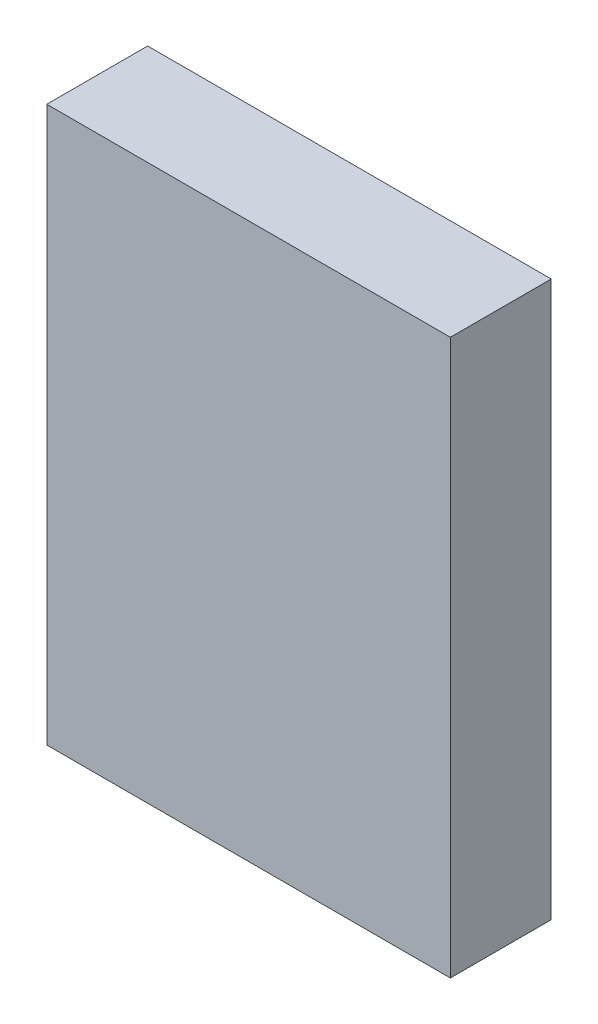
ISO-10303-21;
HEADER;
FILE_DESCRIPTION(('STEP AP214'),'2;1');
FILE_NAME('part.step','',(''),(''),'','','');
FILE_SCHEMA(('AUTOMOTIVE_DESIGN { 1 0 10303 214 1 1 1 1 }'));
ENDSEC;
DATA;
#1=APPLICATION_CONTEXT('core data for automotive mechanical design processes');
#2=APPLICATION_PROTOCOL_DEFINITION('international standard','automotive_design',2000,#1);
#3=PRODUCT_CONTEXT('',#1,'mechanical');
#4=PRODUCT('Part','Part','',(#3));
#5=PRODUCT_RELATED_PRODUCT_CATEGORY('part','',(#4));
#6=PRODUCT_DEFINITION_FORMATION('','',#4);
#7=PRODUCT_DEFINITION_CONTEXT('part definition',#1,'design');
#8=PRODUCT_DEFINITION('design','',#6,#7);
#9=PRODUCT_DEFINITION_SHAPE('','',#8);
#10=(LENGTH_UNIT() NAMED_UNIT(*) SI_UNIT(.MILLI.,.METRE.));
#11=(NAMED_UNIT(*) PLANE_ANGLE_UNIT() SI_UNIT($,.RADIAN.));
#12=(NAMED_UNIT(*) SI_UNIT($,.STERADIAN.) SOLID_ANGLE_UNIT());
#13=UNCERTAINTY_MEASURE_WITH_UNIT(LENGTH_MEASURE(1.E-05),#10,'distance_accuracy_value','');
#14=(GEOMETRIC_REPRESENTATION_CONTEXT(3) GLOBAL_UNCERTAINTY_ASSIGNED_CONTEXT((#13)) GLOBAL_UNIT_ASSIGNED_CONTEXT((#10,
#11,#12)) REPRESENTATION_CONTEXT('',''));
#15=CARTESIAN_POINT('',(0.,0.,0.));
#16=DIRECTION('',(0.,0.,1.));
#17=DIRECTION('',(1.,0.,0.));
#18=AXIS2_PLACEMENT_3D('',#15,#16,#17);
#19=CARTESIAN_POINT('',(0.,0.,0.));
#20=DIRECTION('',(0.,0.,1.));
#21=DIRECTION('',(1.,0.,0.));
#22=AXIS2_PLACEMENT_3D('',#19,#20,#21);
#23=PLANE('',#22);
#24=DIRECTION('',(0.,1.,0.));
#25=VECTOR('',#24,1.);
#26=CARTESIAN_POINT('',(-2.,2.75,0.));
#27=LINE('',#26,#25);
#28=CARTESIAN_POINT('',(-2.,2.75,0.));
#29=VERTEX_POINT('',#28);
#30=CARTESIAN_POINT('',(-2.,-2.75,0.));
#31=VERTEX_POINT('',#30);
#32=EDGE_CURVE('E79',#29,#31,#27,.F.);
#33=ORIENTED_EDGE('',*,*,#32,.F.);
#34=DIRECTION('',(1.,0.,0.));
#35=VECTOR('',#34,1.);
#36=CARTESIAN_POINT('',(2.,2.75,0.));
#37=LINE('',#36,#35);
#38=CARTESIAN_POINT('',(2.,2.75,0.));
#39=VERTEX_POINT('',#38);
#40=EDGE_CURVE('E55',#39,#29,#37,.F.);
#41=ORIENTED_EDGE('',*,*,#40,.F.);
#42=DIRECTION('',(0.,1.,0.));
#43=VECTOR('',#42,1.);
#44=CARTESIAN_POINT('',(2.,-2.75,0.));
#45=LINE('',#44,#43);
#46=CARTESIAN_POINT('',(2.,-2.75,0.));
#47=VERTEX_POINT('',#46);
#48=EDGE_CURVE('E57',#47,#39,#45,.T.);
#49=ORIENTED_EDGE('',*,*,#48,.F.);
#50=DIRECTION('',(1.,0.,0.));
#51=VECTOR('',#50,1.);
#52=CARTESIAN_POINT('',(-2.,-2.75,0.));
#53=LINE('',#52,#51);
#54=EDGE_CURVE('E20',#31,#47,#53,.T.);
#55=ORIENTED_EDGE('',*,*,#54,.F.);
#56=EDGE_LOOP('',(#33,#41,#49,#55));
#57=FACE_BOUND('',#56,.T.);
#58=ADVANCED_FACE('F17',(#57),#23,.F.);
#59=CARTESIAN_POINT('',(-2.,-2.75,0.));
#60=DIRECTION('',(0.,-1.,0.));
#61=DIRECTION('',(0.,0.,-1.));
#62=AXIS2_PLACEMENT_3D('',#59,#60,#61);
#63=PLANE('',#62);
#64=DIRECTION('',(1.,0.,0.));
#65=VECTOR('',#64,1.);
#66=CARTESIAN_POINT('',(0.,-2.75,1.));
#67=LINE('',#66,#65);
#68=CARTESIAN_POINT('',(-2.,-2.75,1.));
#69=VERTEX_POINT('',#68);
#70=CARTESIAN_POINT('',(2.,-2.75,1.));
#71=VERTEX_POINT('',#70);
#72=EDGE_CURVE('E83',#69,#71,#67,.T.);
#73=ORIENTED_EDGE('',*,*,#72,.F.);
#74=DIRECTION('',(0.,0.,1.));
#75=VECTOR('',#74,1.);
#76=CARTESIAN_POINT('',(-2.,-2.75,0.));
#77=LINE('',#76,#75);
#78=EDGE_CURVE('E68',#31,#69,#77,.T.);
#79=ORIENTED_EDGE('',*,*,#78,.F.);
#80=ORIENTED_EDGE('',*,*,#54,.T.);
#81=DIRECTION('',(0.,0.,-1.));
#82=VECTOR('',#81,1.);
#83=CARTESIAN_POINT('',(2.,-2.75,0.));
#84=LINE('',#83,#82);
#85=EDGE_CURVE('E63',#71,#47,#84,.T.);
#86=ORIENTED_EDGE('',*,*,#85,.F.);
#87=EDGE_LOOP('',(#73,#79,#80,#86));
#88=FACE_BOUND('',#87,.T.);
#89=ADVANCED_FACE('F65',(#88),#63,.T.);
#90=CARTESIAN_POINT('',(2.,-2.75,0.));
#91=DIRECTION('',(1.,0.,0.));
#92=DIRECTION('',(0.,0.,-1.));
#93=AXIS2_PLACEMENT_3D('',#90,#91,#92);
#94=PLANE('',#93);
#95=DIRECTION('',(0.,1.,0.));
#96=VECTOR('',#95,1.);
#97=CARTESIAN_POINT('',(2.,0.,1.));
#98=LINE('',#97,#96);
#99=CARTESIAN_POINT('',(2.,2.75,1.));
#100=VERTEX_POINT('',#99);
#101=EDGE_CURVE('E72',#71,#100,#98,.T.);
#102=ORIENTED_EDGE('',*,*,#101,.F.);
#103=ORIENTED_EDGE('',*,*,#85,.T.);
#104=ORIENTED_EDGE('',*,*,#48,.T.);
#105=DIRECTION('',(0.,0.,1.));
#106=VECTOR('',#105,1.);
#107=CARTESIAN_POINT('',(2.,2.75,0.));
#108=LINE('',#107,#106);
#109=EDGE_CURVE('E75',#100,#39,#108,.F.);
#110=ORIENTED_EDGE('',*,*,#109,.F.);
#111=EDGE_LOOP('',(#102,#103,#104,#110));
#112=FACE_BOUND('',#111,.T.);
#113=ADVANCED_FACE('F70',(#112),#94,.T.);
#114=CARTESIAN_POINT('',(2.,2.75,0.));
#115=DIRECTION('',(0.,1.,0.));
#116=DIRECTION('',(0.,0.,1.));
#117=AXIS2_PLACEMENT_3D('',#114,#115,#116);
#118=PLANE('',#117);
#119=DIRECTION('',(1.,0.,0.));
#120=VECTOR('',#119,1.);
#121=CARTESIAN_POINT('',(0.,2.75,1.));
#122=LINE('',#121,#120);
#123=CARTESIAN_POINT('',(-2.,2.75,1.));
#124=VERTEX_POINT('',#123);
#125=EDGE_CURVE('E26',#100,#124,#122,.F.);
#126=ORIENTED_EDGE('',*,*,#125,.F.);
#127=ORIENTED_EDGE('',*,*,#109,.T.);
#128=ORIENTED_EDGE('',*,*,#40,.T.);
#129=DIRECTION('',(0.,0.,1.));
#130=VECTOR('',#129,1.);
#131=CARTESIAN_POINT('',(-2.,2.75,0.));
#132=LINE('',#131,#130);
#133=EDGE_CURVE('E35',#124,#29,#132,.F.);
#134=ORIENTED_EDGE('',*,*,#133,.F.);
#135=EDGE_LOOP('',(#126,#127,#128,#134));
#136=FACE_BOUND('',#135,.T.);
#137=ADVANCED_FACE('F89',(#136),#118,.T.);
#138=CARTESIAN_POINT('',(-2.,2.75,0.));
#139=DIRECTION('',(-1.,0.,0.));
#140=DIRECTION('',(0.,0.,1.));
#141=AXIS2_PLACEMENT_3D('',#138,#139,#140);
#142=PLANE('',#141);
#143=DIRECTION('',(0.,1.,0.));
#144=VECTOR('',#143,1.);
#145=CARTESIAN_POINT('',(-2.,0.,1.));
#146=LINE('',#145,#144);
#147=EDGE_CURVE('E11',#124,#69,#146,.F.);
#148=ORIENTED_EDGE('',*,*,#147,.F.);
#149=ORIENTED_EDGE('',*,*,#133,.T.);
#150=ORIENTED_EDGE('',*,*,#32,.T.);
#151=ORIENTED_EDGE('',*,*,#78,.T.);
#152=EDGE_LOOP('',(#148,#149,#150,#151));
#153=FACE_BOUND('',#152,.T.);
#154=ADVANCED_FACE('F91',(#153),#142,.T.);
#155=CARTESIAN_POINT('',(0.,0.,1.));
#156=DIRECTION('',(0.,0.,1.));
#157=DIRECTION('',(1.,0.,0.));
#158=AXIS2_PLACEMENT_3D('',#155,#156,#157);
#159=PLANE('',#158);
#160=ORIENTED_EDGE('',*,*,#125,.T.);
#161=ORIENTED_EDGE('',*,*,#147,.T.);
#162=ORIENTED_EDGE('',*,*,#72,.T.);
#163=ORIENTED_EDGE('',*,*,#101,.T.);
#164=EDGE_LOOP('',(#160,#161,#162,#163));
#165=FACE_BOUND('',#164,.T.);
#166=ADVANCED_FACE('F88',(#165),#159,.T.);
#167=CLOSED_SHELL('',(#58,#89,#113,#137,#154,#166));
#168=MANIFOLD_SOLID_BREP('B1',#167);
#169=ADVANCED_BREP_SHAPE_REPRESENTATION('',(#18,#168),#14);
#170=SHAPE_DEFINITION_REPRESENTATION(#9,#169);
ENDSEC;
END-ISO-10303-21;
